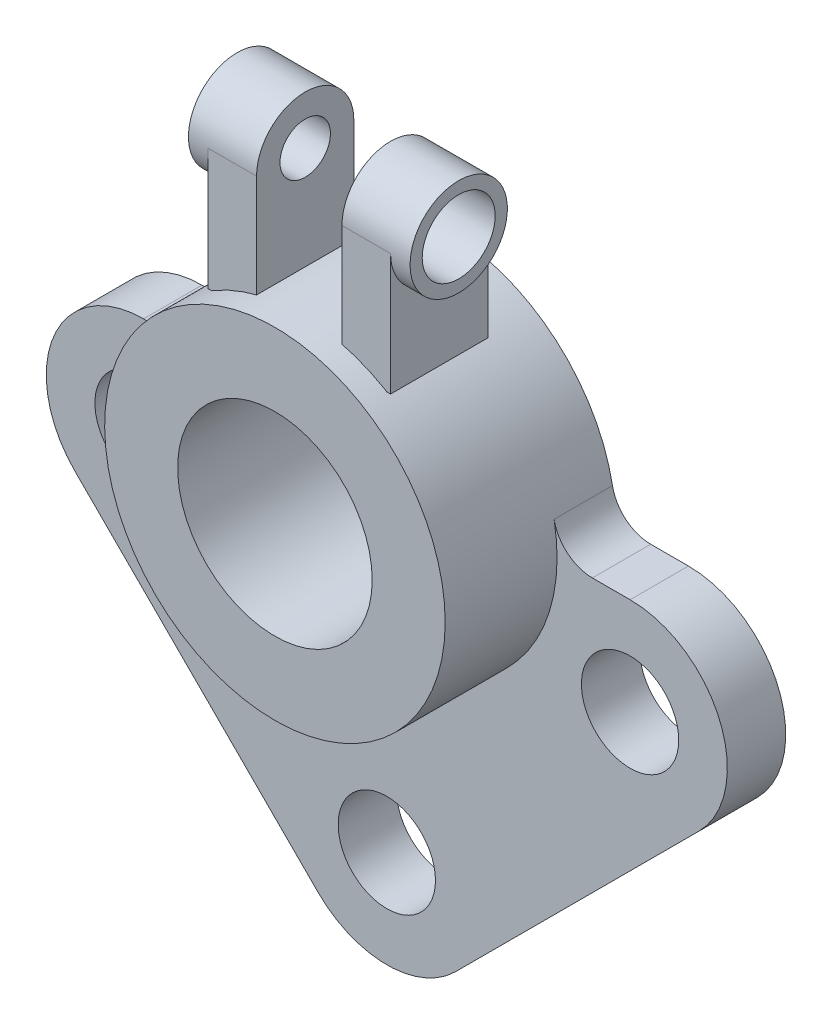
ISO-10303-21;
HEADER;
FILE_DESCRIPTION(('STEP AP214'),'2;1');
FILE_NAME('part.step','',(''),(''),'','','');
FILE_SCHEMA(('AUTOMOTIVE_DESIGN { 1 0 10303 214 1 1 1 1 }'));
ENDSEC;
DATA;
#1=APPLICATION_CONTEXT('core data for automotive mechanical design processes');
#2=APPLICATION_PROTOCOL_DEFINITION('international standard','automotive_design',2000,#1);
#3=PRODUCT_CONTEXT('',#1,'mechanical');
#4=PRODUCT('Part','Part','',(#3));
#5=PRODUCT_RELATED_PRODUCT_CATEGORY('part','',(#4));
#6=PRODUCT_DEFINITION_FORMATION('','',#4);
#7=PRODUCT_DEFINITION_CONTEXT('part definition',#1,'design');
#8=PRODUCT_DEFINITION('design','',#6,#7);
#9=PRODUCT_DEFINITION_SHAPE('','',#8);
#10=(LENGTH_UNIT() NAMED_UNIT(*) SI_UNIT(.MILLI.,.METRE.));
#11=(NAMED_UNIT(*) PLANE_ANGLE_UNIT() SI_UNIT($,.RADIAN.));
#12=(NAMED_UNIT(*) SI_UNIT($,.STERADIAN.) SOLID_ANGLE_UNIT());
#13=UNCERTAINTY_MEASURE_WITH_UNIT(LENGTH_MEASURE(1.E-05),#10,'distance_accuracy_value','');
#14=(GEOMETRIC_REPRESENTATION_CONTEXT(3) GLOBAL_UNCERTAINTY_ASSIGNED_CONTEXT((#13)) GLOBAL_UNIT_ASSIGNED_CONTEXT((#10,
#11,#12)) REPRESENTATION_CONTEXT('',''));
#15=CARTESIAN_POINT('',(0.,0.,0.));
#16=DIRECTION('',(0.,0.,1.));
#17=DIRECTION('',(1.,0.,0.));
#18=AXIS2_PLACEMENT_3D('',#15,#16,#17);
#19=CARTESIAN_POINT('',(-8.77657596376772,55.,30.));
#20=DIRECTION('',(-1.,0.,0.));
#21=DIRECTION('',(0.,0.,1.));
#22=AXIS2_PLACEMENT_3D('',#19,#20,#21);
#23=PLANE('',#22);
#24=CARTESIAN_POINT('',(-8.77657596376772,55.,20.));
#25=DIRECTION('',(1.,0.,0.));
#26=DIRECTION('',(0.,0.,-1.));
#27=AXIS2_PLACEMENT_3D('',#24,#25,#26);
#28=CIRCLE('',#27,5.18228113297328);
#29=CARTESIAN_POINT('',(-8.77657596376772,55.,14.8177188670267));
#30=VERTEX_POINT('',#29);
#31=EDGE_CURVE('E117',#30,#30,#28,.T.);
#32=ORIENTED_EDGE('',*,*,#31,.F.);
#33=EDGE_LOOP('',(#32));
#34=FACE_BOUND('',#33,.T.);
#35=DIRECTION('',(0.,-1.,0.));
#36=VECTOR('',#35,1.);
#37=CARTESIAN_POINT('',(-8.77657596376772,55.,10.));
#38=LINE('',#37,#36);
#39=CARTESIAN_POINT('',(-8.77657596376772,55.,10.));
#40=VERTEX_POINT('',#39);
#41=CARTESIAN_POINT('',(-8.77657596376772,30.,10.));
#42=VERTEX_POINT('',#41);
#43=EDGE_CURVE('E12',#40,#42,#38,.T.);
#44=ORIENTED_EDGE('',*,*,#43,.F.);
#45=CARTESIAN_POINT('',(-8.77657596376772,55.,20.));
#46=DIRECTION('',(1.,0.,0.));
#47=DIRECTION('',(0.,0.,-1.));
#48=AXIS2_PLACEMENT_3D('',#45,#46,#47);
#49=CIRCLE('',#48,10.);
#50=CARTESIAN_POINT('',(-8.77657596376772,55.,30.));
#51=VERTEX_POINT('',#50);
#52=EDGE_CURVE('E101',#40,#51,#49,.T.);
#53=ORIENTED_EDGE('',*,*,#52,.T.);
#54=DIRECTION('',(0.,-1.,0.));
#55=VECTOR('',#54,1.);
#56=CARTESIAN_POINT('',(-8.77657596376772,55.,30.));
#57=LINE('',#56,#55);
#58=CARTESIAN_POINT('',(-8.77657596376772,30.,30.));
#59=VERTEX_POINT('',#58);
#60=EDGE_CURVE('E68',#51,#59,#57,.T.);
#61=ORIENTED_EDGE('',*,*,#60,.T.);
#62=DIRECTION('',(0.,0.,-1.));
#63=VECTOR('',#62,1.);
#64=CARTESIAN_POINT('',(-8.77657596376772,30.,30.));
#65=LINE('',#64,#63);
#66=EDGE_CURVE('E103',#59,#42,#65,.T.);
#67=ORIENTED_EDGE('',*,*,#66,.T.);
#68=EDGE_LOOP('',(#44,#53,#61,#67));
#69=FACE_BOUND('',#68,.T.);
#70=ADVANCED_FACE('F51',(#34,#69),#23,.F.);
#71=CARTESIAN_POINT('',(-8.77657596376772,55.,10.));
#72=DIRECTION('',(0.,0.,1.));
#73=DIRECTION('',(1.,0.,0.));
#74=AXIS2_PLACEMENT_3D('',#71,#72,#73);
#75=PLANE('',#74);
#76=DIRECTION('',(-1.,0.,0.));
#77=VECTOR('',#76,1.);
#78=CARTESIAN_POINT('',(-8.77657596376772,30.,10.));
#79=LINE('',#78,#77);
#80=CARTESIAN_POINT('',(-18.7765759637677,30.,10.));
#81=VERTEX_POINT('',#80);
#82=EDGE_CURVE('E123',#42,#81,#79,.T.);
#83=ORIENTED_EDGE('',*,*,#82,.T.);
#84=DIRECTION('',(0.,-1.,0.));
#85=VECTOR('',#84,1.);
#86=CARTESIAN_POINT('',(-18.7765759637677,55.,10.));
#87=LINE('',#86,#85);
#88=CARTESIAN_POINT('',(-18.7765759637677,55.,10.));
#89=VERTEX_POINT('',#88);
#90=EDGE_CURVE('E60',#89,#81,#87,.T.);
#91=ORIENTED_EDGE('',*,*,#90,.F.);
#92=DIRECTION('',(-1.,0.,0.));
#93=VECTOR('',#92,1.);
#94=CARTESIAN_POINT('',(-8.77657596376772,55.,10.));
#95=LINE('',#94,#93);
#96=EDGE_CURVE('E106',#40,#89,#95,.T.);
#97=ORIENTED_EDGE('',*,*,#96,.F.);
#98=ORIENTED_EDGE('',*,*,#43,.T.);
#99=EDGE_LOOP('',(#83,#91,#97,#98));
#100=FACE_BOUND('',#99,.T.);
#101=ADVANCED_FACE('F107',(#100),#75,.F.);
#102=CARTESIAN_POINT('',(-18.7765759637677,55.,30.));
#103=DIRECTION('',(1.,0.,0.));
#104=DIRECTION('',(0.,0.,-1.));
#105=AXIS2_PLACEMENT_3D('',#102,#103,#104);
#106=PLANE('',#105);
#107=DIRECTION('',(0.,-1.,0.));
#108=VECTOR('',#107,1.);
#109=CARTESIAN_POINT('',(-18.7765759637677,55.,30.));
#110=LINE('',#109,#108);
#111=CARTESIAN_POINT('',(-18.7765759637677,55.,30.));
#112=VERTEX_POINT('',#111);
#113=CARTESIAN_POINT('',(-18.7765759637677,30.,30.));
#114=VERTEX_POINT('',#113);
#115=EDGE_CURVE('E128',#112,#114,#110,.T.);
#116=ORIENTED_EDGE('',*,*,#115,.F.);
#117=CARTESIAN_POINT('',(-18.7765759637677,55.,20.));
#118=DIRECTION('',(1.,0.,0.));
#119=DIRECTION('',(0.,0.,-1.));
#120=AXIS2_PLACEMENT_3D('',#117,#118,#119);
#121=CIRCLE('',#120,10.);
#122=EDGE_CURVE('E92',#112,#89,#121,.T.);
#123=ORIENTED_EDGE('',*,*,#122,.T.);
#124=ORIENTED_EDGE('',*,*,#90,.T.);
#125=DIRECTION('',(0.,0.,1.));
#126=VECTOR('',#125,1.);
#127=CARTESIAN_POINT('',(-18.7765759637677,30.,30.));
#128=LINE('',#127,#126);
#129=EDGE_CURVE('E86',#81,#114,#128,.T.);
#130=ORIENTED_EDGE('',*,*,#129,.T.);
#131=EDGE_LOOP('',(#116,#123,#124,#130));
#132=FACE_BOUND('',#131,.T.);
#133=ADVANCED_FACE('F130',(#132),#106,.F.);
#134=CARTESIAN_POINT('',(-8.77657596376772,55.,30.));
#135=DIRECTION('',(0.,0.,-1.));
#136=DIRECTION('',(-1.,0.,0.));
#137=AXIS2_PLACEMENT_3D('',#134,#135,#136);
#138=PLANE('',#137);
#139=DIRECTION('',(1.,0.,0.));
#140=VECTOR('',#139,1.);
#141=CARTESIAN_POINT('',(-8.77657596376772,30.,30.));
#142=LINE('',#141,#140);
#143=EDGE_CURVE('E89',#114,#59,#142,.T.);
#144=ORIENTED_EDGE('',*,*,#143,.T.);
#145=ORIENTED_EDGE('',*,*,#60,.F.);
#146=DIRECTION('',(1.,0.,0.));
#147=VECTOR('',#146,1.);
#148=CARTESIAN_POINT('',(-8.77657596376772,55.,30.));
#149=LINE('',#148,#147);
#150=EDGE_CURVE('E109',#112,#51,#149,.T.);
#151=ORIENTED_EDGE('',*,*,#150,.F.);
#152=ORIENTED_EDGE('',*,*,#115,.T.);
#153=EDGE_LOOP('',(#144,#145,#151,#152));
#154=FACE_BOUND('',#153,.T.);
#155=ADVANCED_FACE('F134',(#154),#138,.F.);
#156=CARTESIAN_POINT('',(0.,30.,0.));
#157=DIRECTION('',(0.,1.,0.));
#158=DIRECTION('',(0.,0.,1.));
#159=AXIS2_PLACEMENT_3D('',#156,#157,#158);
#160=PLANE('',#159);
#161=ORIENTED_EDGE('',*,*,#66,.F.);
#162=ORIENTED_EDGE('',*,*,#143,.F.);
#163=ORIENTED_EDGE('',*,*,#129,.F.);
#164=ORIENTED_EDGE('',*,*,#82,.F.);
#165=EDGE_LOOP('',(#161,#162,#163,#164));
#166=FACE_BOUND('',#165,.T.);
#167=ADVANCED_FACE('F132',(#166),#160,.F.);
#168=CARTESIAN_POINT('',(-22.7765759637677,55.,20.));
#169=DIRECTION('',(1.,0.,0.));
#170=DIRECTION('',(0.,0.,-1.));
#171=AXIS2_PLACEMENT_3D('',#168,#169,#170);
#172=CYLINDRICAL_SURFACE('',#171,10.);
#173=CARTESIAN_POINT('',(-22.7765759637677,55.,20.));
#174=DIRECTION('',(1.,0.,0.));
#175=DIRECTION('',(0.,0.,-1.));
#176=AXIS2_PLACEMENT_3D('',#173,#174,#175);
#177=CIRCLE('',#176,10.);
#178=CARTESIAN_POINT('',(-22.7765759637677,55.,10.));
#179=VERTEX_POINT('',#178);
#180=EDGE_CURVE('E112',#179,#179,#177,.T.);
#181=ORIENTED_EDGE('',*,*,#180,.T.);
#182=EDGE_LOOP('',(#181));
#183=FACE_BOUND('',#182,.T.);
#184=ORIENTED_EDGE('',*,*,#122,.F.);
#185=ORIENTED_EDGE('',*,*,#150,.T.);
#186=ORIENTED_EDGE('',*,*,#52,.F.);
#187=ORIENTED_EDGE('',*,*,#96,.T.);
#188=EDGE_LOOP('',(#184,#185,#186,#187));
#189=FACE_BOUND('',#188,.T.);
#190=ADVANCED_FACE('F111',(#183,#189),#172,.T.);
#191=CARTESIAN_POINT('',(-22.7765759637677,55.,20.));
#192=DIRECTION('',(1.,0.,0.));
#193=DIRECTION('',(0.,0.,-1.));
#194=AXIS2_PLACEMENT_3D('',#191,#192,#193);
#195=PLANE('',#194);
#196=CARTESIAN_POINT('',(-22.7765759637677,55.,20.));
#197=DIRECTION('',(1.,0.,0.));
#198=DIRECTION('',(0.,0.,-1.));
#199=AXIS2_PLACEMENT_3D('',#196,#197,#198);
#200=CIRCLE('',#199,5.18228113297328);
#201=CARTESIAN_POINT('',(-22.7765759637677,55.,14.8177188670267));
#202=VERTEX_POINT('',#201);
#203=EDGE_CURVE('E54',#202,#202,#200,.T.);
#204=ORIENTED_EDGE('',*,*,#203,.T.);
#205=EDGE_LOOP('',(#204));
#206=FACE_BOUND('',#205,.T.);
#207=ORIENTED_EDGE('',*,*,#180,.F.);
#208=EDGE_LOOP('',(#207));
#209=FACE_BOUND('',#208,.T.);
#210=ADVANCED_FACE('F140',(#206,#209),#195,.F.);
#211=CARTESIAN_POINT('',(-70.,55.,20.));
#212=DIRECTION('',(1.,0.,0.));
#213=DIRECTION('',(0.,0.,-1.));
#214=AXIS2_PLACEMENT_3D('',#211,#212,#213);
#215=CYLINDRICAL_SURFACE('',#214,5.18228113297328);
#216=ORIENTED_EDGE('',*,*,#31,.T.);
#217=EDGE_LOOP('',(#216));
#218=FACE_BOUND('',#217,.T.);
#219=ORIENTED_EDGE('',*,*,#203,.F.);
#220=EDGE_LOOP('',(#219));
#221=FACE_BOUND('',#220,.T.);
#222=ADVANCED_FACE('F152',(#218,#221),#215,.F.);
#223=CLOSED_SHELL('',(#70,#101,#133,#155,#167,#190,#210,#222));
#224=MANIFOLD_SOLID_BREP('B2',#223);
#225=CARTESIAN_POINT('',(8.77657596376772,55.,30.));
#226=DIRECTION('',(1.,0.,0.));
#227=DIRECTION('',(0.,0.,-1.));
#228=AXIS2_PLACEMENT_3D('',#225,#226,#227);
#229=PLANE('',#228);
#230=CARTESIAN_POINT('',(8.77657596376772,55.,20.));
#231=DIRECTION('',(-1.,0.,0.));
#232=DIRECTION('',(0.,0.,1.));
#233=AXIS2_PLACEMENT_3D('',#230,#231,#232);
#234=CIRCLE('',#233,7.5);
#235=CARTESIAN_POINT('',(8.77657596376772,55.,27.5));
#236=VERTEX_POINT('',#235);
#237=EDGE_CURVE('E289',#236,#236,#234,.T.);
#238=ORIENTED_EDGE('',*,*,#237,.F.);
#239=EDGE_LOOP('',(#238));
#240=FACE_BOUND('',#239,.T.);
#241=DIRECTION('',(0.,-1.,0.));
#242=VECTOR('',#241,1.);
#243=CARTESIAN_POINT('',(8.77657596376772,55.,30.));
#244=LINE('',#243,#242);
#245=CARTESIAN_POINT('',(8.77657596376772,55.,30.));
#246=VERTEX_POINT('',#245);
#247=CARTESIAN_POINT('',(8.77657596376772,30.,30.));
#248=VERTEX_POINT('',#247);
#249=EDGE_CURVE('E49',#246,#248,#244,.T.);
#250=ORIENTED_EDGE('',*,*,#249,.F.);
#251=CARTESIAN_POINT('',(8.77657596376772,55.,20.));
#252=DIRECTION('',(-1.,0.,0.));
#253=DIRECTION('',(0.,0.,1.));
#254=AXIS2_PLACEMENT_3D('',#251,#252,#253);
#255=CIRCLE('',#254,10.);
#256=CARTESIAN_POINT('',(8.77657596376772,55.,10.));
#257=VERTEX_POINT('',#256);
#258=EDGE_CURVE('E272',#246,#257,#255,.T.);
#259=ORIENTED_EDGE('',*,*,#258,.T.);
#260=DIRECTION('',(0.,-1.,0.));
#261=VECTOR('',#260,1.);
#262=CARTESIAN_POINT('',(8.77657596376772,55.,10.));
#263=LINE('',#262,#261);
#264=CARTESIAN_POINT('',(8.77657596376772,30.,10.));
#265=VERTEX_POINT('',#264);
#266=EDGE_CURVE('E239',#257,#265,#263,.T.);
#267=ORIENTED_EDGE('',*,*,#266,.T.);
#268=DIRECTION('',(0.,0.,1.));
#269=VECTOR('',#268,1.);
#270=CARTESIAN_POINT('',(8.77657596376772,30.,30.));
#271=LINE('',#270,#269);
#272=EDGE_CURVE('E274',#265,#248,#271,.T.);
#273=ORIENTED_EDGE('',*,*,#272,.T.);
#274=EDGE_LOOP('',(#250,#259,#267,#273));
#275=FACE_BOUND('',#274,.T.);
#276=ADVANCED_FACE('F223',(#240,#275),#229,.F.);
#277=CARTESIAN_POINT('',(8.77657596376772,55.,30.));
#278=DIRECTION('',(0.,0.,-1.));
#279=DIRECTION('',(-1.,0.,0.));
#280=AXIS2_PLACEMENT_3D('',#277,#278,#279);
#281=PLANE('',#280);
#282=DIRECTION('',(1.,0.,0.));
#283=VECTOR('',#282,1.);
#284=CARTESIAN_POINT('',(8.77657596376772,30.,30.));
#285=LINE('',#284,#283);
#286=CARTESIAN_POINT('',(18.7765759637677,30.,30.));
#287=VERTEX_POINT('',#286);
#288=EDGE_CURVE('E296',#248,#287,#285,.T.);
#289=ORIENTED_EDGE('',*,*,#288,.T.);
#290=DIRECTION('',(0.,-1.,0.));
#291=VECTOR('',#290,1.);
#292=CARTESIAN_POINT('',(18.7765759637677,55.,30.));
#293=LINE('',#292,#291);
#294=CARTESIAN_POINT('',(18.7765759637677,55.,30.));
#295=VERTEX_POINT('',#294);
#296=EDGE_CURVE('E231',#295,#287,#293,.T.);
#297=ORIENTED_EDGE('',*,*,#296,.F.);
#298=DIRECTION('',(1.,0.,0.));
#299=VECTOR('',#298,1.);
#300=CARTESIAN_POINT('',(8.77657596376772,55.,30.));
#301=LINE('',#300,#299);
#302=EDGE_CURVE('E277',#246,#295,#301,.T.);
#303=ORIENTED_EDGE('',*,*,#302,.F.);
#304=ORIENTED_EDGE('',*,*,#249,.T.);
#305=EDGE_LOOP('',(#289,#297,#303,#304));
#306=FACE_BOUND('',#305,.T.);
#307=ADVANCED_FACE('F278',(#306),#281,.F.);
#308=CARTESIAN_POINT('',(18.7765759637677,55.,30.));
#309=DIRECTION('',(-1.,0.,0.));
#310=DIRECTION('',(0.,0.,1.));
#311=AXIS2_PLACEMENT_3D('',#308,#309,#310);
#312=PLANE('',#311);
#313=DIRECTION('',(0.,-1.,0.));
#314=VECTOR('',#313,1.);
#315=CARTESIAN_POINT('',(18.7765759637677,55.,10.));
#316=LINE('',#315,#314);
#317=CARTESIAN_POINT('',(18.7765759637677,55.,10.));
#318=VERTEX_POINT('',#317);
#319=CARTESIAN_POINT('',(18.7765759637677,30.,10.));
#320=VERTEX_POINT('',#319);
#321=EDGE_CURVE('E301',#318,#320,#316,.T.);
#322=ORIENTED_EDGE('',*,*,#321,.F.);
#323=CARTESIAN_POINT('',(18.7765759637677,55.,20.));
#324=DIRECTION('',(-1.,0.,0.));
#325=DIRECTION('',(0.,0.,1.));
#326=AXIS2_PLACEMENT_3D('',#323,#324,#325);
#327=CIRCLE('',#326,10.);
#328=EDGE_CURVE('E263',#318,#295,#327,.T.);
#329=ORIENTED_EDGE('',*,*,#328,.T.);
#330=ORIENTED_EDGE('',*,*,#296,.T.);
#331=DIRECTION('',(0.,0.,-1.));
#332=VECTOR('',#331,1.);
#333=CARTESIAN_POINT('',(18.7765759637677,30.,30.));
#334=LINE('',#333,#332);
#335=EDGE_CURVE('E257',#287,#320,#334,.T.);
#336=ORIENTED_EDGE('',*,*,#335,.T.);
#337=EDGE_LOOP('',(#322,#329,#330,#336));
#338=FACE_BOUND('',#337,.T.);
#339=ADVANCED_FACE('F302',(#338),#312,.F.);
#340=CARTESIAN_POINT('',(8.77657596376772,55.,10.));
#341=DIRECTION('',(0.,0.,1.));
#342=DIRECTION('',(1.,0.,0.));
#343=AXIS2_PLACEMENT_3D('',#340,#341,#342);
#344=PLANE('',#343);
#345=DIRECTION('',(-1.,0.,0.));
#346=VECTOR('',#345,1.);
#347=CARTESIAN_POINT('',(8.77657596376772,30.,10.));
#348=LINE('',#347,#346);
#349=EDGE_CURVE('E260',#320,#265,#348,.T.);
#350=ORIENTED_EDGE('',*,*,#349,.T.);
#351=ORIENTED_EDGE('',*,*,#266,.F.);
#352=DIRECTION('',(-1.,0.,0.));
#353=VECTOR('',#352,1.);
#354=CARTESIAN_POINT('',(8.77657596376772,55.,10.));
#355=LINE('',#354,#353);
#356=EDGE_CURVE('E280',#318,#257,#355,.T.);
#357=ORIENTED_EDGE('',*,*,#356,.F.);
#358=ORIENTED_EDGE('',*,*,#321,.T.);
#359=EDGE_LOOP('',(#350,#351,#357,#358));
#360=FACE_BOUND('',#359,.T.);
#361=ADVANCED_FACE('F306',(#360),#344,.F.);
#362=CARTESIAN_POINT('',(0.,30.,0.));
#363=DIRECTION('',(0.,-1.,0.));
#364=DIRECTION('',(0.,0.,-1.));
#365=AXIS2_PLACEMENT_3D('',#362,#363,#364);
#366=PLANE('',#365);
#367=ORIENTED_EDGE('',*,*,#272,.F.);
#368=ORIENTED_EDGE('',*,*,#349,.F.);
#369=ORIENTED_EDGE('',*,*,#335,.F.);
#370=ORIENTED_EDGE('',*,*,#288,.F.);
#371=EDGE_LOOP('',(#367,#368,#369,#370));
#372=FACE_BOUND('',#371,.T.);
#373=ADVANCED_FACE('F304',(#372),#366,.T.);
#374=CARTESIAN_POINT('',(22.7765759637677,55.,20.));
#375=DIRECTION('',(-1.,0.,0.));
#376=DIRECTION('',(0.,0.,1.));
#377=AXIS2_PLACEMENT_3D('',#374,#375,#376);
#378=CYLINDRICAL_SURFACE('',#377,10.);
#379=CARTESIAN_POINT('',(22.7765759637677,55.,20.));
#380=DIRECTION('',(-1.,0.,0.));
#381=DIRECTION('',(0.,0.,1.));
#382=AXIS2_PLACEMENT_3D('',#379,#380,#381);
#383=CIRCLE('',#382,10.);
#384=CARTESIAN_POINT('',(22.7765759637677,55.,30.));
#385=VERTEX_POINT('',#384);
#386=EDGE_CURVE('E283',#385,#385,#383,.T.);
#387=ORIENTED_EDGE('',*,*,#386,.T.);
#388=EDGE_LOOP('',(#387));
#389=FACE_BOUND('',#388,.T.);
#390=ORIENTED_EDGE('',*,*,#302,.T.);
#391=ORIENTED_EDGE('',*,*,#328,.F.);
#392=ORIENTED_EDGE('',*,*,#356,.T.);
#393=ORIENTED_EDGE('',*,*,#258,.F.);
#394=EDGE_LOOP('',(#390,#391,#392,#393));
#395=FACE_BOUND('',#394,.T.);
#396=ADVANCED_FACE('F282',(#389,#395),#378,.T.);
#397=CARTESIAN_POINT('',(22.7765759637677,55.,20.));
#398=DIRECTION('',(-1.,0.,0.));
#399=DIRECTION('',(0.,0.,1.));
#400=AXIS2_PLACEMENT_3D('',#397,#398,#399);
#401=PLANE('',#400);
#402=CARTESIAN_POINT('',(22.7765759637677,55.,20.));
#403=DIRECTION('',(-1.,0.,0.));
#404=DIRECTION('',(0.,0.,1.));
#405=AXIS2_PLACEMENT_3D('',#402,#403,#404);
#406=CIRCLE('',#405,7.5);
#407=CARTESIAN_POINT('',(22.7765759637677,55.,27.5));
#408=VERTEX_POINT('',#407);
#409=EDGE_CURVE('E284',#408,#408,#406,.T.);
#410=ORIENTED_EDGE('',*,*,#409,.T.);
#411=EDGE_LOOP('',(#410));
#412=FACE_BOUND('',#411,.T.);
#413=ORIENTED_EDGE('',*,*,#386,.F.);
#414=EDGE_LOOP('',(#413));
#415=FACE_BOUND('',#414,.T.);
#416=ADVANCED_FACE('F312',(#412,#415),#401,.F.);
#417=CARTESIAN_POINT('',(22.7765759637677,55.,20.));
#418=DIRECTION('',(-1.,0.,0.));
#419=DIRECTION('',(0.,0.,1.));
#420=AXIS2_PLACEMENT_3D('',#417,#418,#419);
#421=CYLINDRICAL_SURFACE('',#420,7.5);
#422=ORIENTED_EDGE('',*,*,#409,.F.);
#423=EDGE_LOOP('',(#422));
#424=FACE_BOUND('',#423,.T.);
#425=ORIENTED_EDGE('',*,*,#237,.T.);
#426=EDGE_LOOP('',(#425));
#427=FACE_BOUND('',#426,.T.);
#428=ADVANCED_FACE('F324',(#424,#427),#421,.F.);
#429=CLOSED_SHELL('',(#276,#307,#339,#361,#373,#396,#416,#428));
#430=MANIFOLD_SOLID_BREP('B6',#429);
#431=CARTESIAN_POINT('',(0.,0.,35.));
#432=DIRECTION('',(0.,0.,-1.));
#433=DIRECTION('',(-1.,0.,0.));
#434=AXIS2_PLACEMENT_3D('',#431,#432,#433);
#435=CYLINDRICAL_SURFACE('',#434,35.);
#436=CARTESIAN_POINT('',(0.,0.,35.));
#437=DIRECTION('',(0.,0.,1.));
#438=DIRECTION('',(1.,0.,0.));
#439=AXIS2_PLACEMENT_3D('',#436,#437,#438);
#440=CIRCLE('',#439,35.);
#441=CARTESIAN_POINT('',(35.,0.,35.));
#442=VERTEX_POINT('',#441);
#443=EDGE_CURVE('E558',#442,#442,#440,.T.);
#444=ORIENTED_EDGE('',*,*,#443,.F.);
#445=EDGE_LOOP('',(#444));
#446=FACE_BOUND('',#445,.T.);
#447=CARTESIAN_POINT('',(0.,0.,0.));
#448=DIRECTION('',(0.,0.,1.));
#449=DIRECTION('',(1.,0.,0.));
#450=AXIS2_PLACEMENT_3D('',#447,#448,#449);
#451=CIRCLE('',#450,35.);
#452=CARTESIAN_POINT('',(34.3889328418473,6.51162790697674,0.));
#453=VERTEX_POINT('',#452);
#454=CARTESIAN_POINT('',(-34.3889328418473,6.51162790697674,0.));
#455=VERTEX_POINT('',#454);
#456=EDGE_CURVE('E554',#453,#455,#451,.T.);
#457=ORIENTED_EDGE('',*,*,#456,.T.);
#458=DIRECTION('',(0.,0.,-1.));
#459=VECTOR('',#458,1.);
#460=CARTESIAN_POINT('',(-34.3889328418473,6.51162790697675,35.));
#461=LINE('',#460,#459);
#462=CARTESIAN_POINT('',(-34.3889328418473,6.51162790697674,12.));
#463=VERTEX_POINT('',#462);
#464=EDGE_CURVE('E572',#455,#463,#461,.F.);
#465=ORIENTED_EDGE('',*,*,#464,.T.);
#466=CARTESIAN_POINT('',(0.,0.,12.));
#467=DIRECTION('',(0.,0.,-1.));
#468=DIRECTION('',(1.,0.,0.));
#469=AXIS2_PLACEMENT_3D('',#466,#467,#468);
#470=CIRCLE('',#469,35.);
#471=CARTESIAN_POINT('',(34.3889328418473,6.51162790697674,12.));
#472=VERTEX_POINT('',#471);
#473=EDGE_CURVE('E476',#472,#463,#470,.T.);
#474=ORIENTED_EDGE('',*,*,#473,.F.);
#475=DIRECTION('',(0.,0.,-1.));
#476=VECTOR('',#475,1.);
#477=CARTESIAN_POINT('',(34.3889328418473,6.51162790697675,35.));
#478=LINE('',#477,#476);
#479=EDGE_CURVE('E568',#472,#453,#478,.T.);
#480=ORIENTED_EDGE('',*,*,#479,.T.);
#481=EDGE_LOOP('',(#457,#465,#474,#480));
#482=FACE_BOUND('',#481,.T.);
#483=ADVANCED_FACE('F385',(#446,#482),#435,.T.);
#484=CARTESIAN_POINT('',(0.,0.,35.));
#485=DIRECTION('',(0.,0.,1.));
#486=DIRECTION('',(1.,0.,0.));
#487=AXIS2_PLACEMENT_3D('',#484,#485,#486);
#488=PLANE('',#487);
#489=ORIENTED_EDGE('',*,*,#443,.T.);
#490=EDGE_LOOP('',(#489));
#491=FACE_BOUND('',#490,.T.);
#492=CARTESIAN_POINT('',(0.,0.,35.));
#493=DIRECTION('',(0.,0.,1.));
#494=DIRECTION('',(1.,0.,0.));
#495=AXIS2_PLACEMENT_3D('',#492,#493,#494);
#496=CIRCLE('',#495,20.);
#497=CARTESIAN_POINT('',(20.,0.,35.));
#498=VERTEX_POINT('',#497);
#499=EDGE_CURVE('E550',#498,#498,#496,.T.);
#500=ORIENTED_EDGE('',*,*,#499,.F.);
#501=EDGE_LOOP('',(#500));
#502=FACE_BOUND('',#501,.T.);
#503=ADVANCED_FACE('F602',(#491,#502),#488,.T.);
#504=CARTESIAN_POINT('',(0.,0.,0.));
#505=DIRECTION('',(0.,0.,1.));
#506=DIRECTION('',(1.,0.,0.));
#507=AXIS2_PLACEMENT_3D('',#504,#505,#506);
#508=PLANE('',#507);
#509=ORIENTED_EDGE('',*,*,#456,.F.);
#510=CARTESIAN_POINT('',(42.2492603485552,8.,0.));
#511=DIRECTION('',(0.,0.,1.));
#512=DIRECTION('',(1.,0.,0.));
#513=AXIS2_PLACEMENT_3D('',#510,#511,#512);
#514=CIRCLE('',#513,8.);
#515=CARTESIAN_POINT('',(42.2492603485552,0.,0.));
#516=VERTEX_POINT('',#515);
#517=EDGE_CURVE('E394',#453,#516,#514,.T.);
#518=ORIENTED_EDGE('',*,*,#517,.T.);
#519=DIRECTION('',(-1.,0.,0.));
#520=VECTOR('',#519,1.);
#521=CARTESIAN_POINT('',(50.,0.,0.));
#522=LINE('',#521,#520);
#523=CARTESIAN_POINT('',(50.,0.,0.));
#524=VERTEX_POINT('',#523);
#525=EDGE_CURVE('E530',#524,#516,#522,.T.);
#526=ORIENTED_EDGE('',*,*,#525,.F.);
#527=CARTESIAN_POINT('',(50.,-20.,0.));
#528=DIRECTION('',(0.,0.,1.));
#529=DIRECTION('',(1.,0.,0.));
#530=AXIS2_PLACEMENT_3D('',#527,#528,#529);
#531=CIRCLE('',#530,20.);
#532=CARTESIAN_POINT('',(64.1421356237309,-34.1421356237309,0.));
#533=VERTEX_POINT('',#532);
#534=EDGE_CURVE('E527',#533,#524,#531,.T.);
#535=ORIENTED_EDGE('',*,*,#534,.F.);
#536=DIRECTION('',(0.707106781186547,0.707106781186548,0.));
#537=VECTOR('',#536,1.);
#538=CARTESIAN_POINT('',(14.1421356237309,-84.1421356237309,0.));
#539=LINE('',#538,#537);
#540=CARTESIAN_POINT('',(14.1421356237309,-84.1421356237309,0.));
#541=VERTEX_POINT('',#540);
#542=EDGE_CURVE('E524',#541,#533,#539,.T.);
#543=ORIENTED_EDGE('',*,*,#542,.F.);
#544=CARTESIAN_POINT('',(0.,-70.,0.));
#545=DIRECTION('',(0.,0.,1.));
#546=DIRECTION('',(-1.,0.,0.));
#547=AXIS2_PLACEMENT_3D('',#544,#545,#546);
#548=CIRCLE('',#547,20.);
#549=CARTESIAN_POINT('',(-14.1421356237309,-84.1421356237309,0.));
#550=VERTEX_POINT('',#549);
#551=EDGE_CURVE('E521',#550,#541,#548,.T.);
#552=ORIENTED_EDGE('',*,*,#551,.F.);
#553=DIRECTION('',(0.707106781186547,-0.707106781186548,0.));
#554=VECTOR('',#553,1.);
#555=CARTESIAN_POINT('',(-64.1421356237309,-34.1421356237309,0.));
#556=LINE('',#555,#554);
#557=CARTESIAN_POINT('',(-64.142135623731,-34.1421356237309,0.));
#558=VERTEX_POINT('',#557);
#559=EDGE_CURVE('E518',#558,#550,#556,.T.);
#560=ORIENTED_EDGE('',*,*,#559,.F.);
#561=CARTESIAN_POINT('',(-50.,-20.,0.));
#562=DIRECTION('',(0.,0.,1.));
#563=DIRECTION('',(1.,0.,0.));
#564=AXIS2_PLACEMENT_3D('',#561,#562,#563);
#565=CIRCLE('',#564,20.);
#566=CARTESIAN_POINT('',(-50.,0.,0.));
#567=VERTEX_POINT('',#566);
#568=EDGE_CURVE('E514',#567,#558,#565,.T.);
#569=ORIENTED_EDGE('',*,*,#568,.F.);
#570=DIRECTION('',(-1.,0.,0.));
#571=VECTOR('',#570,1.);
#572=CARTESIAN_POINT('',(-50.,0.,0.));
#573=LINE('',#572,#571);
#574=CARTESIAN_POINT('',(-42.2492603485552,0.,0.));
#575=VERTEX_POINT('',#574);
#576=EDGE_CURVE('E482',#575,#567,#573,.T.);
#577=ORIENTED_EDGE('',*,*,#576,.F.);
#578=CARTESIAN_POINT('',(-42.2492603485552,8.,0.));
#579=DIRECTION('',(0.,0.,1.));
#580=DIRECTION('',(1.,0.,0.));
#581=AXIS2_PLACEMENT_3D('',#578,#579,#580);
#582=CIRCLE('',#581,8.);
#583=EDGE_CURVE('E578',#575,#455,#582,.T.);
#584=ORIENTED_EDGE('',*,*,#583,.T.);
#585=EDGE_LOOP('',(#509,#518,#526,#535,#543,#552,#560,#569,#577,#584));
#586=FACE_BOUND('',#585,.T.);
#587=CARTESIAN_POINT('',(0.,0.,0.));
#588=DIRECTION('',(0.,0.,1.));
#589=DIRECTION('',(1.,0.,0.));
#590=AXIS2_PLACEMENT_3D('',#587,#588,#589);
#591=CIRCLE('',#590,20.);
#592=CARTESIAN_POINT('',(20.,0.,0.));
#593=VERTEX_POINT('',#592);
#594=EDGE_CURVE('E486',#593,#593,#591,.T.);
#595=ORIENTED_EDGE('',*,*,#594,.T.);
#596=EDGE_LOOP('',(#595));
#597=FACE_BOUND('',#596,.T.);
#598=CARTESIAN_POINT('',(0.,-70.,0.));
#599=DIRECTION('',(0.,0.,1.));
#600=DIRECTION('',(1.,0.,0.));
#601=AXIS2_PLACEMENT_3D('',#598,#599,#600);
#602=CIRCLE('',#601,10.);
#603=CARTESIAN_POINT('',(10.,-70.,0.));
#604=VERTEX_POINT('',#603);
#605=EDGE_CURVE('E664',#604,#604,#602,.T.);
#606=ORIENTED_EDGE('',*,*,#605,.T.);
#607=EDGE_LOOP('',(#606));
#608=FACE_BOUND('',#607,.T.);
#609=CARTESIAN_POINT('',(-50.,-20.,0.));
#610=DIRECTION('',(0.,0.,1.));
#611=DIRECTION('',(1.,0.,0.));
#612=AXIS2_PLACEMENT_3D('',#609,#610,#611);
#613=CIRCLE('',#612,10.);
#614=CARTESIAN_POINT('',(-40.,-20.,0.));
#615=VERTEX_POINT('',#614);
#616=EDGE_CURVE('E657',#615,#615,#613,.T.);
#617=ORIENTED_EDGE('',*,*,#616,.T.);
#618=EDGE_LOOP('',(#617));
#619=FACE_BOUND('',#618,.T.);
#620=CARTESIAN_POINT('',(50.,-20.,0.));
#621=DIRECTION('',(0.,0.,1.));
#622=DIRECTION('',(1.,0.,0.));
#623=AXIS2_PLACEMENT_3D('',#620,#621,#622);
#624=CIRCLE('',#623,10.);
#625=CARTESIAN_POINT('',(60.,-20.,0.));
#626=VERTEX_POINT('',#625);
#627=EDGE_CURVE('E667',#626,#626,#624,.T.);
#628=ORIENTED_EDGE('',*,*,#627,.T.);
#629=EDGE_LOOP('',(#628));
#630=FACE_BOUND('',#629,.T.);
#631=ADVANCED_FACE('F583',(#586,#597,#608,#619,#630),#508,.F.);
#632=CARTESIAN_POINT('',(0.,0.,35.));
#633=DIRECTION('',(0.,0.,-1.));
#634=DIRECTION('',(-1.,0.,0.));
#635=AXIS2_PLACEMENT_3D('',#632,#633,#634);
#636=CYLINDRICAL_SURFACE('',#635,20.);
#637=ORIENTED_EDGE('',*,*,#499,.T.);
#638=EDGE_LOOP('',(#637));
#639=FACE_BOUND('',#638,.T.);
#640=ORIENTED_EDGE('',*,*,#594,.F.);
#641=EDGE_LOOP('',(#640));
#642=FACE_BOUND('',#641,.T.);
#643=ADVANCED_FACE('F612',(#639,#642),#636,.F.);
#644=CARTESIAN_POINT('',(0.,0.,12.));
#645=DIRECTION('',(0.,0.,1.));
#646=DIRECTION('',(1.,0.,0.));
#647=AXIS2_PLACEMENT_3D('',#644,#645,#646);
#648=PLANE('',#647);
#649=CARTESIAN_POINT('',(-50.,-20.,12.));
#650=DIRECTION('',(0.,0.,1.));
#651=DIRECTION('',(1.,0.,0.));
#652=AXIS2_PLACEMENT_3D('',#649,#650,#651);
#653=CIRCLE('',#652,10.);
#654=CARTESIAN_POINT('',(-40.,-20.,12.));
#655=VERTEX_POINT('',#654);
#656=EDGE_CURVE('E654',#655,#655,#653,.T.);
#657=ORIENTED_EDGE('',*,*,#656,.F.);
#658=EDGE_LOOP('',(#657));
#659=FACE_BOUND('',#658,.T.);
#660=ORIENTED_EDGE('',*,*,#473,.T.);
#661=CARTESIAN_POINT('',(-42.2492603485552,8.,12.));
#662=DIRECTION('',(0.,0.,1.));
#663=DIRECTION('',(1.,0.,0.));
#664=AXIS2_PLACEMENT_3D('',#661,#662,#663);
#665=CIRCLE('',#664,8.);
#666=CARTESIAN_POINT('',(-42.2492603485552,0.,12.));
#667=VERTEX_POINT('',#666);
#668=EDGE_CURVE('E471',#463,#667,#665,.F.);
#669=ORIENTED_EDGE('',*,*,#668,.T.);
#670=DIRECTION('',(-1.,0.,0.));
#671=VECTOR('',#670,1.);
#672=CARTESIAN_POINT('',(-50.,0.,12.));
#673=LINE('',#672,#671);
#674=CARTESIAN_POINT('',(-50.,0.,12.));
#675=VERTEX_POINT('',#674);
#676=EDGE_CURVE('E463',#667,#675,#673,.T.);
#677=ORIENTED_EDGE('',*,*,#676,.T.);
#678=CARTESIAN_POINT('',(-50.,-20.,12.));
#679=DIRECTION('',(0.,0.,1.));
#680=DIRECTION('',(1.,0.,0.));
#681=AXIS2_PLACEMENT_3D('',#678,#679,#680);
#682=CIRCLE('',#681,20.);
#683=CARTESIAN_POINT('',(-64.142135623731,-34.1421356237309,12.));
#684=VERTEX_POINT('',#683);
#685=EDGE_CURVE('E468',#675,#684,#682,.T.);
#686=ORIENTED_EDGE('',*,*,#685,.T.);
#687=DIRECTION('',(0.707106781186547,-0.707106781186548,0.));
#688=VECTOR('',#687,1.);
#689=CARTESIAN_POINT('',(-64.1421356237309,-34.1421356237309,12.));
#690=LINE('',#689,#688);
#691=CARTESIAN_POINT('',(-14.1421356237309,-84.1421356237309,12.));
#692=VERTEX_POINT('',#691);
#693=EDGE_CURVE('E493',#684,#692,#690,.T.);
#694=ORIENTED_EDGE('',*,*,#693,.T.);
#695=CARTESIAN_POINT('',(0.,-70.,12.));
#696=DIRECTION('',(0.,0.,1.));
#697=DIRECTION('',(-1.,0.,0.));
#698=AXIS2_PLACEMENT_3D('',#695,#696,#697);
#699=CIRCLE('',#698,20.);
#700=CARTESIAN_POINT('',(14.1421356237309,-84.1421356237309,12.));
#701=VERTEX_POINT('',#700);
#702=EDGE_CURVE('E496',#692,#701,#699,.T.);
#703=ORIENTED_EDGE('',*,*,#702,.T.);
#704=DIRECTION('',(0.707106781186547,0.707106781186548,0.));
#705=VECTOR('',#704,1.);
#706=CARTESIAN_POINT('',(14.1421356237309,-84.1421356237309,12.));
#707=LINE('',#706,#705);
#708=CARTESIAN_POINT('',(64.1421356237309,-34.1421356237309,12.));
#709=VERTEX_POINT('',#708);
#710=EDGE_CURVE('E502',#701,#709,#707,.T.);
#711=ORIENTED_EDGE('',*,*,#710,.T.);
#712=CARTESIAN_POINT('',(50.,-20.,12.));
#713=DIRECTION('',(0.,0.,1.));
#714=DIRECTION('',(1.,0.,0.));
#715=AXIS2_PLACEMENT_3D('',#712,#713,#714);
#716=CIRCLE('',#715,20.);
#717=CARTESIAN_POINT('',(50.,0.,12.));
#718=VERTEX_POINT('',#717);
#719=EDGE_CURVE('E505',#709,#718,#716,.T.);
#720=ORIENTED_EDGE('',*,*,#719,.T.);
#721=DIRECTION('',(-1.,0.,0.));
#722=VECTOR('',#721,1.);
#723=CARTESIAN_POINT('',(50.,0.,12.));
#724=LINE('',#723,#722);
#725=CARTESIAN_POINT('',(42.2492603485552,0.,12.));
#726=VERTEX_POINT('',#725);
#727=EDGE_CURVE('E508',#718,#726,#724,.T.);
#728=ORIENTED_EDGE('',*,*,#727,.T.);
#729=CARTESIAN_POINT('',(42.2492603485552,8.,12.));
#730=DIRECTION('',(0.,0.,1.));
#731=DIRECTION('',(1.,0.,0.));
#732=AXIS2_PLACEMENT_3D('',#729,#730,#731);
#733=CIRCLE('',#732,8.);
#734=EDGE_CURVE('E221',#726,#472,#733,.F.);
#735=ORIENTED_EDGE('',*,*,#734,.T.);
#736=EDGE_LOOP('',(#660,#669,#677,#686,#694,#703,#711,#720,#728,#735));
#737=FACE_BOUND('',#736,.T.);
#738=CARTESIAN_POINT('',(0.,-70.,12.));
#739=DIRECTION('',(0.,0.,1.));
#740=DIRECTION('',(1.,0.,0.));
#741=AXIS2_PLACEMENT_3D('',#738,#739,#740);
#742=CIRCLE('',#741,10.);
#743=CARTESIAN_POINT('',(10.,-70.,12.));
#744=VERTEX_POINT('',#743);
#745=EDGE_CURVE('E515',#744,#744,#742,.T.);
#746=ORIENTED_EDGE('',*,*,#745,.F.);
#747=EDGE_LOOP('',(#746));
#748=FACE_BOUND('',#747,.T.);
#749=CARTESIAN_POINT('',(50.,-20.,12.));
#750=DIRECTION('',(0.,0.,1.));
#751=DIRECTION('',(1.,0.,0.));
#752=AXIS2_PLACEMENT_3D('',#749,#750,#751);
#753=CIRCLE('',#752,10.);
#754=CARTESIAN_POINT('',(60.,-20.,12.));
#755=VERTEX_POINT('',#754);
#756=EDGE_CURVE('E660',#755,#755,#753,.T.);
#757=ORIENTED_EDGE('',*,*,#756,.F.);
#758=EDGE_LOOP('',(#757));
#759=FACE_BOUND('',#758,.T.);
#760=ADVANCED_FACE('F465',(#659,#737,#748,#759),#648,.T.);
#761=CARTESIAN_POINT('',(-50.,0.,12.));
#762=DIRECTION('',(0.,-1.,0.));
#763=DIRECTION('',(0.,0.,-1.));
#764=AXIS2_PLACEMENT_3D('',#761,#762,#763);
#765=PLANE('',#764);
#766=ORIENTED_EDGE('',*,*,#676,.F.);
#767=DIRECTION('',(0.,0.,1.));
#768=VECTOR('',#767,1.);
#769=CARTESIAN_POINT('',(-42.2492603485552,0.,0.));
#770=LINE('',#769,#768);
#771=EDGE_CURVE('E562',#667,#575,#770,.F.);
#772=ORIENTED_EDGE('',*,*,#771,.T.);
#773=ORIENTED_EDGE('',*,*,#576,.T.);
#774=DIRECTION('',(0.,0.,-1.));
#775=VECTOR('',#774,1.);
#776=CARTESIAN_POINT('',(-50.,0.,12.));
#777=LINE('',#776,#775);
#778=EDGE_CURVE('E479',#675,#567,#777,.T.);
#779=ORIENTED_EDGE('',*,*,#778,.F.);
#780=EDGE_LOOP('',(#766,#772,#773,#779));
#781=FACE_BOUND('',#780,.T.);
#782=ADVANCED_FACE('F480',(#781),#765,.F.);
#783=CARTESIAN_POINT('',(-50.,-20.,12.));
#784=DIRECTION('',(0.,0.,-1.));
#785=DIRECTION('',(-1.,0.,0.));
#786=AXIS2_PLACEMENT_3D('',#783,#784,#785);
#787=CYLINDRICAL_SURFACE('',#786,20.);
#788=ORIENTED_EDGE('',*,*,#568,.T.);
#789=DIRECTION('',(0.,0.,-1.));
#790=VECTOR('',#789,1.);
#791=CARTESIAN_POINT('',(-64.142135623731,-34.1421356237309,12.));
#792=LINE('',#791,#790);
#793=EDGE_CURVE('E487',#684,#558,#792,.T.);
#794=ORIENTED_EDGE('',*,*,#793,.F.);
#795=ORIENTED_EDGE('',*,*,#685,.F.);
#796=ORIENTED_EDGE('',*,*,#778,.T.);
#797=EDGE_LOOP('',(#788,#794,#795,#796));
#798=FACE_BOUND('',#797,.T.);
#799=ADVANCED_FACE('F489',(#798),#787,.T.);
#800=CARTESIAN_POINT('',(-64.1421356237309,-34.1421356237309,12.));
#801=DIRECTION('',(0.707106781186548,0.707106781186547,0.));
#802=DIRECTION('',(-0.707106781186547,0.707106781186548,0.));
#803=AXIS2_PLACEMENT_3D('',#800,#801,#802);
#804=PLANE('',#803);
#805=ORIENTED_EDGE('',*,*,#559,.T.);
#806=DIRECTION('',(0.,0.,-1.));
#807=VECTOR('',#806,1.);
#808=CARTESIAN_POINT('',(-14.1421356237309,-84.1421356237309,12.));
#809=LINE('',#808,#807);
#810=EDGE_CURVE('E544',#692,#550,#809,.T.);
#811=ORIENTED_EDGE('',*,*,#810,.F.);
#812=ORIENTED_EDGE('',*,*,#693,.F.);
#813=ORIENTED_EDGE('',*,*,#793,.T.);
#814=EDGE_LOOP('',(#805,#811,#812,#813));
#815=FACE_BOUND('',#814,.T.);
#816=ADVANCED_FACE('F621',(#815),#804,.F.);
#817=CARTESIAN_POINT('',(0.,-70.,12.));
#818=DIRECTION('',(0.,0.,-1.));
#819=DIRECTION('',(-1.,0.,0.));
#820=AXIS2_PLACEMENT_3D('',#817,#818,#819);
#821=CYLINDRICAL_SURFACE('',#820,20.);
#822=ORIENTED_EDGE('',*,*,#551,.T.);
#823=DIRECTION('',(0.,0.,-1.));
#824=VECTOR('',#823,1.);
#825=CARTESIAN_POINT('',(14.1421356237309,-84.1421356237309,12.));
#826=LINE('',#825,#824);
#827=EDGE_CURVE('E540',#701,#541,#826,.T.);
#828=ORIENTED_EDGE('',*,*,#827,.F.);
#829=ORIENTED_EDGE('',*,*,#702,.F.);
#830=ORIENTED_EDGE('',*,*,#810,.T.);
#831=EDGE_LOOP('',(#822,#828,#829,#830));
#832=FACE_BOUND('',#831,.T.);
#833=ADVANCED_FACE('F624',(#832),#821,.T.);
#834=CARTESIAN_POINT('',(14.1421356237309,-84.1421356237309,12.));
#835=DIRECTION('',(-0.707106781186548,0.707106781186547,0.));
#836=DIRECTION('',(-0.707106781186547,-0.707106781186548,0.));
#837=AXIS2_PLACEMENT_3D('',#834,#835,#836);
#838=PLANE('',#837);
#839=ORIENTED_EDGE('',*,*,#542,.T.);
#840=DIRECTION('',(0.,0.,-1.));
#841=VECTOR('',#840,1.);
#842=CARTESIAN_POINT('',(64.1421356237309,-34.1421356237309,12.));
#843=LINE('',#842,#841);
#844=EDGE_CURVE('E536',#709,#533,#843,.T.);
#845=ORIENTED_EDGE('',*,*,#844,.F.);
#846=ORIENTED_EDGE('',*,*,#710,.F.);
#847=ORIENTED_EDGE('',*,*,#827,.T.);
#848=EDGE_LOOP('',(#839,#845,#846,#847));
#849=FACE_BOUND('',#848,.T.);
#850=ADVANCED_FACE('F628',(#849),#838,.F.);
#851=CARTESIAN_POINT('',(50.,-20.,12.));
#852=DIRECTION('',(0.,0.,-1.));
#853=DIRECTION('',(-1.,0.,0.));
#854=AXIS2_PLACEMENT_3D('',#851,#852,#853);
#855=CYLINDRICAL_SURFACE('',#854,20.);
#856=ORIENTED_EDGE('',*,*,#534,.T.);
#857=DIRECTION('',(0.,0.,-1.));
#858=VECTOR('',#857,1.);
#859=CARTESIAN_POINT('',(50.,0.,12.));
#860=LINE('',#859,#858);
#861=EDGE_CURVE('E511',#718,#524,#860,.T.);
#862=ORIENTED_EDGE('',*,*,#861,.F.);
#863=ORIENTED_EDGE('',*,*,#719,.F.);
#864=ORIENTED_EDGE('',*,*,#844,.T.);
#865=EDGE_LOOP('',(#856,#862,#863,#864));
#866=FACE_BOUND('',#865,.T.);
#867=ADVANCED_FACE('F632',(#866),#855,.T.);
#868=CARTESIAN_POINT('',(50.,0.,12.));
#869=DIRECTION('',(0.,-1.,0.));
#870=DIRECTION('',(0.,0.,-1.));
#871=AXIS2_PLACEMENT_3D('',#868,#869,#870);
#872=PLANE('',#871);
#873=ORIENTED_EDGE('',*,*,#525,.T.);
#874=DIRECTION('',(0.,0.,1.));
#875=VECTOR('',#874,1.);
#876=CARTESIAN_POINT('',(42.2492603485552,0.,12.));
#877=LINE('',#876,#875);
#878=EDGE_CURVE('E401',#516,#726,#877,.T.);
#879=ORIENTED_EDGE('',*,*,#878,.T.);
#880=ORIENTED_EDGE('',*,*,#727,.F.);
#881=ORIENTED_EDGE('',*,*,#861,.T.);
#882=EDGE_LOOP('',(#873,#879,#880,#881));
#883=FACE_BOUND('',#882,.T.);
#884=ADVANCED_FACE('F636',(#883),#872,.F.);
#885=CARTESIAN_POINT('',(0.,-70.,12.));
#886=DIRECTION('',(0.,0.,-1.));
#887=DIRECTION('',(-1.,0.,0.));
#888=AXIS2_PLACEMENT_3D('',#885,#886,#887);
#889=CYLINDRICAL_SURFACE('',#888,10.);
#890=ORIENTED_EDGE('',*,*,#745,.T.);
#891=EDGE_LOOP('',(#890));
#892=FACE_BOUND('',#891,.T.);
#893=ORIENTED_EDGE('',*,*,#605,.F.);
#894=EDGE_LOOP('',(#893));
#895=FACE_BOUND('',#894,.T.);
#896=ADVANCED_FACE('F640',(#892,#895),#889,.F.);
#897=CARTESIAN_POINT('',(-50.,-20.,12.));
#898=DIRECTION('',(0.,0.,-1.));
#899=DIRECTION('',(-1.,0.,0.));
#900=AXIS2_PLACEMENT_3D('',#897,#898,#899);
#901=CYLINDRICAL_SURFACE('',#900,10.);
#902=ORIENTED_EDGE('',*,*,#656,.T.);
#903=EDGE_LOOP('',(#902));
#904=FACE_BOUND('',#903,.T.);
#905=ORIENTED_EDGE('',*,*,#616,.F.);
#906=EDGE_LOOP('',(#905));
#907=FACE_BOUND('',#906,.T.);
#908=ADVANCED_FACE('F597',(#904,#907),#901,.F.);
#909=CARTESIAN_POINT('',(50.,-20.,12.));
#910=DIRECTION('',(0.,0.,-1.));
#911=DIRECTION('',(-1.,0.,0.));
#912=AXIS2_PLACEMENT_3D('',#909,#910,#911);
#913=CYLINDRICAL_SURFACE('',#912,10.);
#914=ORIENTED_EDGE('',*,*,#756,.T.);
#915=EDGE_LOOP('',(#914));
#916=FACE_BOUND('',#915,.T.);
#917=ORIENTED_EDGE('',*,*,#627,.F.);
#918=EDGE_LOOP('',(#917));
#919=FACE_BOUND('',#918,.T.);
#920=ADVANCED_FACE('F591',(#916,#919),#913,.F.);
#921=CARTESIAN_POINT('',(-42.2492603485552,8.,35.));
#922=DIRECTION('',(0.,0.,-1.));
#923=DIRECTION('',(-1.,0.,0.));
#924=AXIS2_PLACEMENT_3D('',#921,#922,#923);
#925=CYLINDRICAL_SURFACE('',#924,8.);
#926=ORIENTED_EDGE('',*,*,#668,.F.);
#927=ORIENTED_EDGE('',*,*,#464,.F.);
#928=ORIENTED_EDGE('',*,*,#583,.F.);
#929=ORIENTED_EDGE('',*,*,#771,.F.);
#930=EDGE_LOOP('',(#926,#927,#928,#929));
#931=FACE_BOUND('',#930,.T.);
#932=ADVANCED_FACE('F589',(#931),#925,.F.);
#933=CARTESIAN_POINT('',(42.2492603485552,8.,35.));
#934=DIRECTION('',(0.,0.,-1.));
#935=DIRECTION('',(-1.,0.,0.));
#936=AXIS2_PLACEMENT_3D('',#933,#934,#935);
#937=CYLINDRICAL_SURFACE('',#936,8.);
#938=ORIENTED_EDGE('',*,*,#734,.F.);
#939=ORIENTED_EDGE('',*,*,#878,.F.);
#940=ORIENTED_EDGE('',*,*,#517,.F.);
#941=ORIENTED_EDGE('',*,*,#479,.F.);
#942=EDGE_LOOP('',(#938,#939,#940,#941));
#943=FACE_BOUND('',#942,.T.);
#944=ADVANCED_FACE('F387',(#943),#937,.F.);
#945=CLOSED_SHELL('',(#483,#503,#631,#643,#760,#782,#799,#816,#833,#850,#867,#884,#896,#908,
#920,#932,#944));
#946=MANIFOLD_SOLID_BREP('B43',#945);
#947=ADVANCED_BREP_SHAPE_REPRESENTATION('',(#18,#224,#430,#946),#14);
#948=SHAPE_DEFINITION_REPRESENTATION(#9,#947);
ENDSEC;
END-ISO-10303-21;
